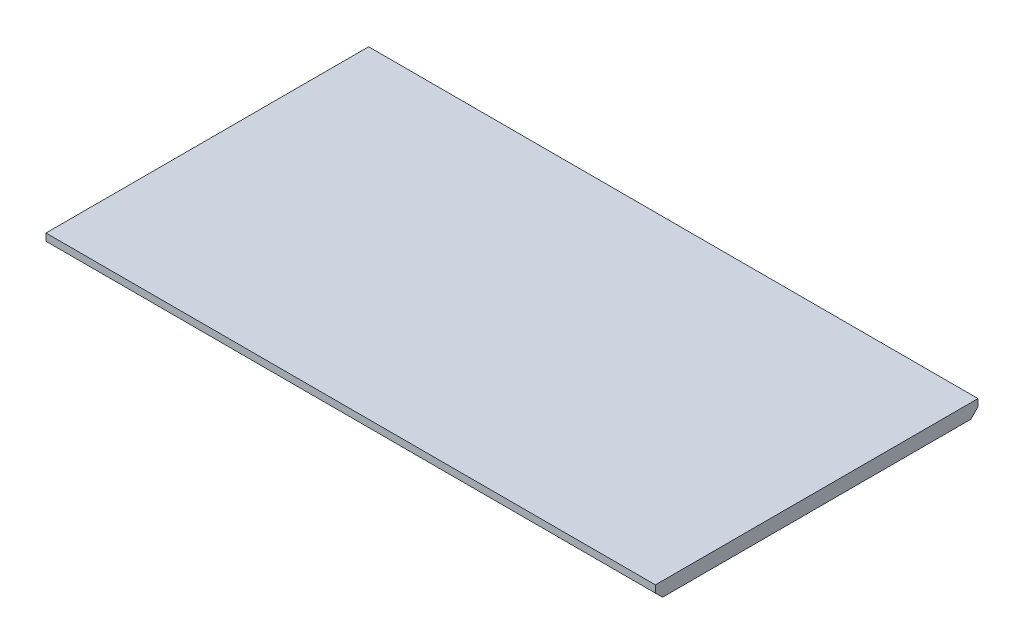
ISO-10303-21;
HEADER;
FILE_DESCRIPTION(('STEP AP214'),'2;1');
FILE_NAME('part.step','',(''),(''),'','','');
FILE_SCHEMA(('AUTOMOTIVE_DESIGN { 1 0 10303 214 1 1 1 1 }'));
ENDSEC;
DATA;
#1=APPLICATION_CONTEXT('core data for automotive mechanical design processes');
#2=APPLICATION_PROTOCOL_DEFINITION('international standard','automotive_design',2000,#1);
#3=PRODUCT_CONTEXT('',#1,'mechanical');
#4=PRODUCT('Part','Part','',(#3));
#5=PRODUCT_RELATED_PRODUCT_CATEGORY('part','',(#4));
#6=PRODUCT_DEFINITION_FORMATION('','',#4);
#7=PRODUCT_DEFINITION_CONTEXT('part definition',#1,'design');
#8=PRODUCT_DEFINITION('design','',#6,#7);
#9=PRODUCT_DEFINITION_SHAPE('','',#8);
#10=(LENGTH_UNIT() NAMED_UNIT(*) SI_UNIT(.MILLI.,.METRE.));
#11=(NAMED_UNIT(*) PLANE_ANGLE_UNIT() SI_UNIT($,.RADIAN.));
#12=(NAMED_UNIT(*) SI_UNIT($,.STERADIAN.) SOLID_ANGLE_UNIT());
#13=UNCERTAINTY_MEASURE_WITH_UNIT(LENGTH_MEASURE(1.E-05),#10,'distance_accuracy_value','');
#14=(GEOMETRIC_REPRESENTATION_CONTEXT(3) GLOBAL_UNCERTAINTY_ASSIGNED_CONTEXT((#13)) GLOBAL_UNIT_ASSIGNED_CONTEXT((#10,
#11,#12)) REPRESENTATION_CONTEXT('',''));
#15=CARTESIAN_POINT('',(0.,0.,0.));
#16=DIRECTION('',(0.,0.,1.));
#17=DIRECTION('',(1.,0.,0.));
#18=AXIS2_PLACEMENT_3D('',#15,#16,#17);
#19=CARTESIAN_POINT('',(42.5,2.,22.5));
#20=DIRECTION('',(-1.,0.,0.));
#21=DIRECTION('',(0.,0.,1.));
#22=AXIS2_PLACEMENT_3D('',#19,#20,#21);
#23=PLANE('',#22);
#24=DIRECTION('',(0.,0.,-1.));
#25=VECTOR('',#24,1.);
#26=CARTESIAN_POINT('',(42.5,0.,22.5));
#27=LINE('',#26,#25);
#28=CARTESIAN_POINT('',(42.5,0.,21.5));
#29=VERTEX_POINT('',#28);
#30=CARTESIAN_POINT('',(42.5,0.,-21.5));
#31=VERTEX_POINT('',#30);
#32=EDGE_CURVE('E128',#29,#31,#27,.T.);
#33=ORIENTED_EDGE('',*,*,#32,.T.);
#34=DIRECTION('',(0.,0.707106781186548,-0.707106781186548));
#35=VECTOR('',#34,1.);
#36=CARTESIAN_POINT('',(42.5,0.999999999999987,-22.5));
#37=LINE('',#36,#35);
#38=CARTESIAN_POINT('',(42.5,0.999999999999987,-22.5));
#39=VERTEX_POINT('',#38);
#40=EDGE_CURVE('E43',#31,#39,#37,.T.);
#41=ORIENTED_EDGE('',*,*,#40,.T.);
#42=DIRECTION('',(0.,-1.,0.));
#43=VECTOR('',#42,1.);
#44=CARTESIAN_POINT('',(42.5,2.,-22.5));
#45=LINE('',#44,#43);
#46=CARTESIAN_POINT('',(42.5,2.,-22.5));
#47=VERTEX_POINT('',#46);
#48=EDGE_CURVE('E95',#47,#39,#45,.T.);
#49=ORIENTED_EDGE('',*,*,#48,.F.);
#50=DIRECTION('',(0.,0.,-1.));
#51=VECTOR('',#50,1.);
#52=CARTESIAN_POINT('',(42.5,2.,22.5));
#53=LINE('',#52,#51);
#54=CARTESIAN_POINT('',(42.5,2.,22.5));
#55=VERTEX_POINT('',#54);
#56=EDGE_CURVE('E102',#55,#47,#53,.T.);
#57=ORIENTED_EDGE('',*,*,#56,.F.);
#58=DIRECTION('',(0.,-1.,0.));
#59=VECTOR('',#58,1.);
#60=CARTESIAN_POINT('',(42.5,2.,22.5));
#61=LINE('',#60,#59);
#62=CARTESIAN_POINT('',(42.5,0.999999999999987,22.5));
#63=VERTEX_POINT('',#62);
#64=EDGE_CURVE('E129',#55,#63,#61,.T.);
#65=ORIENTED_EDGE('',*,*,#64,.T.);
#66=DIRECTION('',(0.,-0.707106781186548,-0.707106781186548));
#67=VECTOR('',#66,1.);
#68=CARTESIAN_POINT('',(42.5,0.999999999999987,22.5));
#69=LINE('',#68,#67);
#70=EDGE_CURVE('E50',#63,#29,#69,.T.);
#71=ORIENTED_EDGE('',*,*,#70,.T.);
#72=EDGE_LOOP('',(#33,#41,#49,#57,#65,#71));
#73=FACE_BOUND('',#72,.T.);
#74=ADVANCED_FACE('F35',(#73),#23,.F.);
#75=CARTESIAN_POINT('',(-42.5,2.,-22.5));
#76=DIRECTION('',(0.,0.,1.));
#77=DIRECTION('',(1.,0.,0.));
#78=AXIS2_PLACEMENT_3D('',#75,#76,#77);
#79=PLANE('',#78);
#80=ORIENTED_EDGE('',*,*,#48,.T.);
#81=DIRECTION('',(-1.,0.,0.));
#82=VECTOR('',#81,1.);
#83=CARTESIAN_POINT('',(-42.5,0.999999999999987,-22.5));
#84=LINE('',#83,#82);
#85=CARTESIAN_POINT('',(-42.5,0.999999999999987,-22.5));
#86=VERTEX_POINT('',#85);
#87=EDGE_CURVE('E114',#39,#86,#84,.T.);
#88=ORIENTED_EDGE('',*,*,#87,.T.);
#89=DIRECTION('',(0.,-1.,0.));
#90=VECTOR('',#89,1.);
#91=CARTESIAN_POINT('',(-42.5,2.,-22.5));
#92=LINE('',#91,#90);
#93=CARTESIAN_POINT('',(-42.5,2.,-22.5));
#94=VERTEX_POINT('',#93);
#95=EDGE_CURVE('E98',#94,#86,#92,.T.);
#96=ORIENTED_EDGE('',*,*,#95,.F.);
#97=DIRECTION('',(-1.,0.,0.));
#98=VECTOR('',#97,1.);
#99=CARTESIAN_POINT('',(-42.5,2.,-22.5));
#100=LINE('',#99,#98);
#101=EDGE_CURVE('E90',#47,#94,#100,.T.);
#102=ORIENTED_EDGE('',*,*,#101,.F.);
#103=EDGE_LOOP('',(#80,#88,#96,#102));
#104=FACE_BOUND('',#103,.T.);
#105=ADVANCED_FACE('F92',(#104),#79,.F.);
#106=CARTESIAN_POINT('',(-42.5,2.,22.5));
#107=DIRECTION('',(1.,0.,0.));
#108=DIRECTION('',(0.,0.,-1.));
#109=AXIS2_PLACEMENT_3D('',#106,#107,#108);
#110=PLANE('',#109);
#111=ORIENTED_EDGE('',*,*,#95,.T.);
#112=DIRECTION('',(0.,-0.707106781186548,0.707106781186548));
#113=VECTOR('',#112,1.);
#114=CARTESIAN_POINT('',(-42.5,0.999999999999987,-22.5));
#115=LINE('',#114,#113);
#116=CARTESIAN_POINT('',(-42.5,0.,-21.5));
#117=VERTEX_POINT('',#116);
#118=EDGE_CURVE('E123',#86,#117,#115,.T.);
#119=ORIENTED_EDGE('',*,*,#118,.T.);
#120=DIRECTION('',(0.,0.,1.));
#121=VECTOR('',#120,1.);
#122=CARTESIAN_POINT('',(-42.5,0.,22.5));
#123=LINE('',#122,#121);
#124=CARTESIAN_POINT('',(-42.5,0.,21.5));
#125=VERTEX_POINT('',#124);
#126=EDGE_CURVE('E111',#117,#125,#123,.T.);
#127=ORIENTED_EDGE('',*,*,#126,.T.);
#128=DIRECTION('',(0.,0.707106781186548,0.707106781186548));
#129=VECTOR('',#128,1.);
#130=CARTESIAN_POINT('',(-42.5,0.999999999999987,22.5));
#131=LINE('',#130,#129);
#132=CARTESIAN_POINT('',(-42.5,0.999999999999987,22.5));
#133=VERTEX_POINT('',#132);
#134=EDGE_CURVE('E116',#125,#133,#131,.T.);
#135=ORIENTED_EDGE('',*,*,#134,.T.);
#136=DIRECTION('',(0.,-1.,0.));
#137=VECTOR('',#136,1.);
#138=CARTESIAN_POINT('',(-42.5,2.,22.5));
#139=LINE('',#138,#137);
#140=CARTESIAN_POINT('',(-42.5,2.,22.5));
#141=VERTEX_POINT('',#140);
#142=EDGE_CURVE('E118',#141,#133,#139,.T.);
#143=ORIENTED_EDGE('',*,*,#142,.F.);
#144=DIRECTION('',(0.,0.,1.));
#145=VECTOR('',#144,1.);
#146=CARTESIAN_POINT('',(-42.5,2.,22.5));
#147=LINE('',#146,#145);
#148=EDGE_CURVE('E101',#94,#141,#147,.T.);
#149=ORIENTED_EDGE('',*,*,#148,.F.);
#150=EDGE_LOOP('',(#111,#119,#127,#135,#143,#149));
#151=FACE_BOUND('',#150,.T.);
#152=ADVANCED_FACE('F137',(#151),#110,.F.);
#153=CARTESIAN_POINT('',(-42.5,2.,22.5));
#154=DIRECTION('',(0.,0.,-1.));
#155=DIRECTION('',(-1.,0.,0.));
#156=AXIS2_PLACEMENT_3D('',#153,#154,#155);
#157=PLANE('',#156);
#158=ORIENTED_EDGE('',*,*,#142,.T.);
#159=DIRECTION('',(1.,0.,0.));
#160=VECTOR('',#159,1.);
#161=CARTESIAN_POINT('',(42.5,0.999999999999987,22.5));
#162=LINE('',#161,#160);
#163=EDGE_CURVE('E11',#133,#63,#162,.T.);
#164=ORIENTED_EDGE('',*,*,#163,.T.);
#165=ORIENTED_EDGE('',*,*,#64,.F.);
#166=DIRECTION('',(1.,0.,0.));
#167=VECTOR('',#166,1.);
#168=CARTESIAN_POINT('',(-42.5,2.,22.5));
#169=LINE('',#168,#167);
#170=EDGE_CURVE('E107',#141,#55,#169,.T.);
#171=ORIENTED_EDGE('',*,*,#170,.F.);
#172=EDGE_LOOP('',(#158,#164,#165,#171));
#173=FACE_BOUND('',#172,.T.);
#174=ADVANCED_FACE('F139',(#173),#157,.F.);
#175=CARTESIAN_POINT('',(0.,2.,0.));
#176=DIRECTION('',(0.,-1.,0.));
#177=DIRECTION('',(0.,0.,-1.));
#178=AXIS2_PLACEMENT_3D('',#175,#176,#177);
#179=PLANE('',#178);
#180=ORIENTED_EDGE('',*,*,#56,.T.);
#181=ORIENTED_EDGE('',*,*,#101,.T.);
#182=ORIENTED_EDGE('',*,*,#148,.T.);
#183=ORIENTED_EDGE('',*,*,#170,.T.);
#184=EDGE_LOOP('',(#180,#181,#182,#183));
#185=FACE_BOUND('',#184,.T.);
#186=ADVANCED_FACE('F105',(#185),#179,.F.);
#187=CARTESIAN_POINT('',(0.,0.,0.));
#188=DIRECTION('',(0.,-1.,0.));
#189=DIRECTION('',(0.,0.,-1.));
#190=AXIS2_PLACEMENT_3D('',#187,#188,#189);
#191=PLANE('',#190);
#192=ORIENTED_EDGE('',*,*,#126,.F.);
#193=DIRECTION('',(1.,0.,0.));
#194=VECTOR('',#193,1.);
#195=CARTESIAN_POINT('',(42.5,0.,-21.5));
#196=LINE('',#195,#194);
#197=EDGE_CURVE('E57',#117,#31,#196,.T.);
#198=ORIENTED_EDGE('',*,*,#197,.T.);
#199=ORIENTED_EDGE('',*,*,#32,.F.);
#200=DIRECTION('',(-1.,0.,0.));
#201=VECTOR('',#200,1.);
#202=CARTESIAN_POINT('',(-42.5,0.,21.5));
#203=LINE('',#202,#201);
#204=EDGE_CURVE('E125',#29,#125,#203,.T.);
#205=ORIENTED_EDGE('',*,*,#204,.T.);
#206=EDGE_LOOP('',(#192,#198,#199,#205));
#207=FACE_BOUND('',#206,.T.);
#208=ADVANCED_FACE('F130',(#207),#191,.T.);
#209=CARTESIAN_POINT('',(-42.5,0.999999999999987,-22.5));
#210=DIRECTION('',(0.,-0.707106781186547,-0.707106781186547));
#211=DIRECTION('',(1.,0.,0.));
#212=AXIS2_PLACEMENT_3D('',#209,#210,#211);
#213=PLANE('',#212);
#214=ORIENTED_EDGE('',*,*,#40,.F.);
#215=ORIENTED_EDGE('',*,*,#197,.F.);
#216=ORIENTED_EDGE('',*,*,#118,.F.);
#217=ORIENTED_EDGE('',*,*,#87,.F.);
#218=EDGE_LOOP('',(#214,#215,#216,#217));
#219=FACE_BOUND('',#218,.T.);
#220=ADVANCED_FACE('F145',(#219),#213,.T.);
#221=CARTESIAN_POINT('',(-42.5,0.999999999999987,22.5));
#222=DIRECTION('',(0.,-0.707106781186547,0.707106781186547));
#223=DIRECTION('',(-1.,0.,0.));
#224=AXIS2_PLACEMENT_3D('',#221,#222,#223);
#225=PLANE('',#224);
#226=ORIENTED_EDGE('',*,*,#134,.F.);
#227=ORIENTED_EDGE('',*,*,#204,.F.);
#228=ORIENTED_EDGE('',*,*,#70,.F.);
#229=ORIENTED_EDGE('',*,*,#163,.F.);
#230=EDGE_LOOP('',(#226,#227,#228,#229));
#231=FACE_BOUND('',#230,.T.);
#232=ADVANCED_FACE('F37',(#231),#225,.T.);
#233=CLOSED_SHELL('',(#74,#105,#152,#174,#186,#208,#220,#232));
#234=MANIFOLD_SOLID_BREP('B2',#233);
#235=ADVANCED_BREP_SHAPE_REPRESENTATION('',(#18,#234),#14);
#236=SHAPE_DEFINITION_REPRESENTATION(#9,#235);
ENDSEC;
END-ISO-10303-21;
